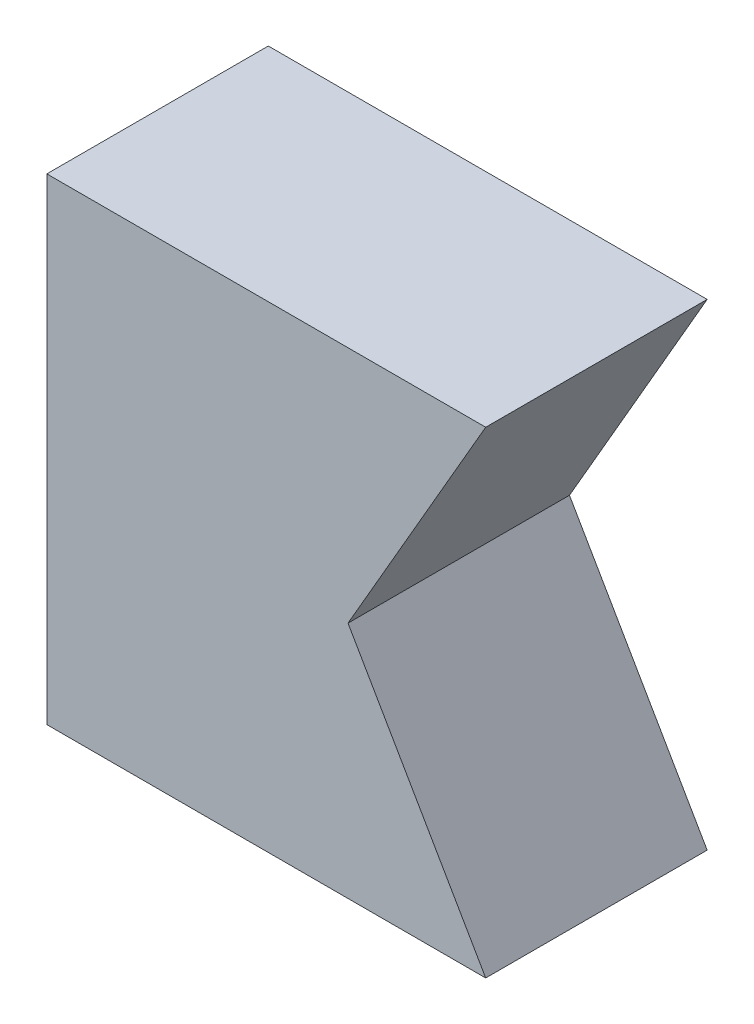
ISO-10303-21;
HEADER;
FILE_DESCRIPTION(('STEP AP214'),'2;1');
FILE_NAME('part.step','',(''),(''),'','','');
FILE_SCHEMA(('AUTOMOTIVE_DESIGN { 1 0 10303 214 1 1 1 1 }'));
ENDSEC;
DATA;
#1=APPLICATION_CONTEXT('core data for automotive mechanical design processes');
#2=APPLICATION_PROTOCOL_DEFINITION('international standard','automotive_design',2000,#1);
#3=PRODUCT_CONTEXT('',#1,'mechanical');
#4=PRODUCT('Part','Part','',(#3));
#5=PRODUCT_RELATED_PRODUCT_CATEGORY('part','',(#4));
#6=PRODUCT_DEFINITION_FORMATION('','',#4);
#7=PRODUCT_DEFINITION_CONTEXT('part definition',#1,'design');
#8=PRODUCT_DEFINITION('design','',#6,#7);
#9=PRODUCT_DEFINITION_SHAPE('','',#8);
#10=(LENGTH_UNIT() NAMED_UNIT(*) SI_UNIT(.MILLI.,.METRE.));
#11=(NAMED_UNIT(*) PLANE_ANGLE_UNIT() SI_UNIT($,.RADIAN.));
#12=(NAMED_UNIT(*) SI_UNIT($,.STERADIAN.) SOLID_ANGLE_UNIT());
#13=UNCERTAINTY_MEASURE_WITH_UNIT(LENGTH_MEASURE(1.E-05),#10,'distance_accuracy_value','');
#14=(GEOMETRIC_REPRESENTATION_CONTEXT(3) GLOBAL_UNCERTAINTY_ASSIGNED_CONTEXT((#13)) GLOBAL_UNIT_ASSIGNED_CONTEXT((#10,
#11,#12)) REPRESENTATION_CONTEXT('',''));
#15=CARTESIAN_POINT('',(0.,0.,0.));
#16=DIRECTION('',(0.,0.,1.));
#17=DIRECTION('',(1.,0.,0.));
#18=AXIS2_PLACEMENT_3D('',#15,#16,#17);
#19=CARTESIAN_POINT('',(-7.,-4.,24.));
#20=DIRECTION('',(1.,0.,0.));
#21=DIRECTION('',(0.,0.,-1.));
#22=AXIS2_PLACEMENT_3D('',#19,#20,#21);
#23=PLANE('',#22);
#24=DIRECTION('',(0.,0.,1.));
#25=VECTOR('',#24,1.);
#26=CARTESIAN_POINT('',(-7.,-2.8,-1.3));
#27=LINE('',#26,#25);
#28=CARTESIAN_POINT('',(-7.,-2.8,-1.3));
#29=VERTEX_POINT('',#28);
#30=CARTESIAN_POINT('',(-7.,-2.8,1.3));
#31=VERTEX_POINT('',#30);
#32=EDGE_CURVE('E100',#29,#31,#27,.T.);
#33=ORIENTED_EDGE('',*,*,#32,.T.);
#34=DIRECTION('',(0.,1.,0.));
#35=VECTOR('',#34,1.);
#36=CARTESIAN_POINT('',(-7.,-2.8,1.3));
#37=LINE('',#36,#35);
#38=CARTESIAN_POINT('',(-7.,2.8,1.3));
#39=VERTEX_POINT('',#38);
#40=EDGE_CURVE('E98',#31,#39,#37,.T.);
#41=ORIENTED_EDGE('',*,*,#40,.T.);
#42=DIRECTION('',(0.,0.,-1.));
#43=VECTOR('',#42,1.);
#44=CARTESIAN_POINT('',(-7.,2.8,1.3));
#45=LINE('',#44,#43);
#46=CARTESIAN_POINT('',(-7.,2.8,-1.3));
#47=VERTEX_POINT('',#46);
#48=EDGE_CURVE('E56',#39,#47,#45,.T.);
#49=ORIENTED_EDGE('',*,*,#48,.T.);
#50=DIRECTION('',(0.,-1.,0.));
#51=VECTOR('',#50,1.);
#52=CARTESIAN_POINT('',(-7.,2.8,-1.3));
#53=LINE('',#52,#51);
#54=EDGE_CURVE('E90',#47,#29,#53,.T.);
#55=ORIENTED_EDGE('',*,*,#54,.T.);
#56=EDGE_LOOP('',(#33,#41,#49,#55));
#57=FACE_BOUND('',#56,.T.);
#58=ADVANCED_FACE('F34',(#57),#23,.F.);
#59=CARTESIAN_POINT('',(-1.73205080756888,-2.8,-1.3));
#60=DIRECTION('',(0.,-1.,0.));
#61=DIRECTION('',(0.,0.,-1.));
#62=AXIS2_PLACEMENT_3D('',#59,#60,#61);
#63=PLANE('',#62);
#64=DIRECTION('',(0.,0.,1.));
#65=VECTOR('',#64,1.);
#66=CARTESIAN_POINT('',(-1.8475208614068,-2.8,-1.5));
#67=LINE('',#66,#65);
#68=CARTESIAN_POINT('',(-1.8475208614068,-2.8,-1.3));
#69=VERTEX_POINT('',#68);
#70=CARTESIAN_POINT('',(-1.8475208614068,-2.8,1.3));
#71=VERTEX_POINT('',#70);
#72=EDGE_CURVE('E41',#69,#71,#67,.T.);
#73=ORIENTED_EDGE('',*,*,#72,.T.);
#74=DIRECTION('',(-1.,0.,0.));
#75=VECTOR('',#74,1.);
#76=CARTESIAN_POINT('',(-1.73205080756888,-2.8,1.3));
#77=LINE('',#76,#75);
#78=EDGE_CURVE('E48',#71,#31,#77,.T.);
#79=ORIENTED_EDGE('',*,*,#78,.T.);
#80=ORIENTED_EDGE('',*,*,#32,.F.);
#81=DIRECTION('',(-1.,0.,0.));
#82=VECTOR('',#81,1.);
#83=CARTESIAN_POINT('',(-1.73205080756888,-2.8,-1.3));
#84=LINE('',#83,#82);
#85=EDGE_CURVE('E86',#69,#29,#84,.T.);
#86=ORIENTED_EDGE('',*,*,#85,.F.);
#87=EDGE_LOOP('',(#73,#79,#80,#86));
#88=FACE_BOUND('',#87,.T.);
#89=ADVANCED_FACE('F118',(#88),#63,.T.);
#90=CARTESIAN_POINT('',(-1.73205080756888,2.8,-1.3));
#91=DIRECTION('',(0.,0.,-1.));
#92=DIRECTION('',(0.,1.,0.));
#93=AXIS2_PLACEMENT_3D('',#90,#91,#92);
#94=PLANE('',#93);
#95=DIRECTION('',(-0.5,-0.866025403784439,0.));
#96=VECTOR('',#95,1.);
#97=CARTESIAN_POINT('',(-1.73205080756888,3.,-1.3));
#98=LINE('',#97,#96);
#99=CARTESIAN_POINT('',(-1.8475208614068,2.8,-1.3));
#100=VERTEX_POINT('',#99);
#101=CARTESIAN_POINT('',(-3.46410161513775,0.,-1.3));
#102=VERTEX_POINT('',#101);
#103=EDGE_CURVE('E114',#100,#102,#98,.T.);
#104=ORIENTED_EDGE('',*,*,#103,.T.);
#105=DIRECTION('',(0.5,-0.866025403784439,0.));
#106=VECTOR('',#105,1.);
#107=CARTESIAN_POINT('',(-3.46410161513775,0.,-1.3));
#108=LINE('',#107,#106);
#109=EDGE_CURVE('E112',#102,#69,#108,.T.);
#110=ORIENTED_EDGE('',*,*,#109,.T.);
#111=ORIENTED_EDGE('',*,*,#85,.T.);
#112=ORIENTED_EDGE('',*,*,#54,.F.);
#113=DIRECTION('',(-1.,0.,0.));
#114=VECTOR('',#113,1.);
#115=CARTESIAN_POINT('',(-1.73205080756888,2.8,-1.3));
#116=LINE('',#115,#114);
#117=EDGE_CURVE('E79',#100,#47,#116,.T.);
#118=ORIENTED_EDGE('',*,*,#117,.F.);
#119=EDGE_LOOP('',(#104,#110,#111,#112,#118));
#120=FACE_BOUND('',#119,.T.);
#121=ADVANCED_FACE('F91',(#120),#94,.T.);
#122=CARTESIAN_POINT('',(-1.73205080756888,2.8,1.3));
#123=DIRECTION('',(0.,1.,0.));
#124=DIRECTION('',(0.,0.,1.));
#125=AXIS2_PLACEMENT_3D('',#122,#123,#124);
#126=PLANE('',#125);
#127=DIRECTION('',(0.,0.,-1.));
#128=VECTOR('',#127,1.);
#129=CARTESIAN_POINT('',(-1.8475208614068,2.8,-1.5));
#130=LINE('',#129,#128);
#131=CARTESIAN_POINT('',(-1.8475208614068,2.8,1.3));
#132=VERTEX_POINT('',#131);
#133=EDGE_CURVE('E83',#132,#100,#130,.T.);
#134=ORIENTED_EDGE('',*,*,#133,.T.);
#135=ORIENTED_EDGE('',*,*,#117,.T.);
#136=ORIENTED_EDGE('',*,*,#48,.F.);
#137=DIRECTION('',(-1.,0.,0.));
#138=VECTOR('',#137,1.);
#139=CARTESIAN_POINT('',(-1.73205080756888,2.8,1.3));
#140=LINE('',#139,#138);
#141=EDGE_CURVE('E87',#132,#39,#140,.T.);
#142=ORIENTED_EDGE('',*,*,#141,.F.);
#143=EDGE_LOOP('',(#134,#135,#136,#142));
#144=FACE_BOUND('',#143,.T.);
#145=ADVANCED_FACE('F81',(#144),#126,.T.);
#146=CARTESIAN_POINT('',(-1.73205080756888,-2.8,1.3));
#147=DIRECTION('',(0.,0.,1.));
#148=DIRECTION('',(0.,-1.,0.));
#149=AXIS2_PLACEMENT_3D('',#146,#147,#148);
#150=PLANE('',#149);
#151=DIRECTION('',(0.5,0.866025403784439,0.));
#152=VECTOR('',#151,1.);
#153=CARTESIAN_POINT('',(-1.73205080756888,3.,1.3));
#154=LINE('',#153,#152);
#155=CARTESIAN_POINT('',(-3.46410161513775,0.,1.3));
#156=VERTEX_POINT('',#155);
#157=EDGE_CURVE('E109',#156,#132,#154,.T.);
#158=ORIENTED_EDGE('',*,*,#157,.T.);
#159=ORIENTED_EDGE('',*,*,#141,.T.);
#160=ORIENTED_EDGE('',*,*,#40,.F.);
#161=ORIENTED_EDGE('',*,*,#78,.F.);
#162=DIRECTION('',(-0.5,0.866025403784439,0.));
#163=VECTOR('',#162,1.);
#164=CARTESIAN_POINT('',(-3.46410161513775,0.,1.3));
#165=LINE('',#164,#163);
#166=EDGE_CURVE('E104',#71,#156,#165,.T.);
#167=ORIENTED_EDGE('',*,*,#166,.T.);
#168=EDGE_LOOP('',(#158,#159,#160,#161,#167));
#169=FACE_BOUND('',#168,.T.);
#170=ADVANCED_FACE('F124',(#169),#150,.T.);
#171=CARTESIAN_POINT('',(-1.73205080756888,3.,-1.5));
#172=DIRECTION('',(-0.866025403784439,0.5,0.));
#173=DIRECTION('',(-0.5,-0.866025403784439,0.));
#174=AXIS2_PLACEMENT_3D('',#171,#172,#173);
#175=PLANE('',#174);
#176=ORIENTED_EDGE('',*,*,#103,.F.);
#177=ORIENTED_EDGE('',*,*,#133,.F.);
#178=ORIENTED_EDGE('',*,*,#157,.F.);
#179=DIRECTION('',(0.,0.,1.));
#180=VECTOR('',#179,1.);
#181=CARTESIAN_POINT('',(-3.46410161513775,0.,-1.5));
#182=LINE('',#181,#180);
#183=EDGE_CURVE('E12',#102,#156,#182,.T.);
#184=ORIENTED_EDGE('',*,*,#183,.F.);
#185=EDGE_LOOP('',(#176,#177,#178,#184));
#186=FACE_BOUND('',#185,.T.);
#187=ADVANCED_FACE('F126',(#186),#175,.F.);
#188=CARTESIAN_POINT('',(-3.46410161513775,0.,-1.5));
#189=DIRECTION('',(-0.866025403784439,-0.5,0.));
#190=DIRECTION('',(0.5,-0.866025403784439,0.));
#191=AXIS2_PLACEMENT_3D('',#188,#189,#190);
#192=PLANE('',#191);
#193=ORIENTED_EDGE('',*,*,#109,.F.);
#194=ORIENTED_EDGE('',*,*,#183,.T.);
#195=ORIENTED_EDGE('',*,*,#166,.F.);
#196=ORIENTED_EDGE('',*,*,#72,.F.);
#197=EDGE_LOOP('',(#193,#194,#195,#196));
#198=FACE_BOUND('',#197,.T.);
#199=ADVANCED_FACE('F121',(#198),#192,.F.);
#200=CLOSED_SHELL('',(#58,#89,#121,#145,#170,#187,#199));
#201=MANIFOLD_SOLID_BREP('B2',#200);
#202=ADVANCED_BREP_SHAPE_REPRESENTATION('',(#18,#201),#14);
#203=SHAPE_DEFINITION_REPRESENTATION(#9,#202);
ENDSEC;
END-ISO-10303-21;
